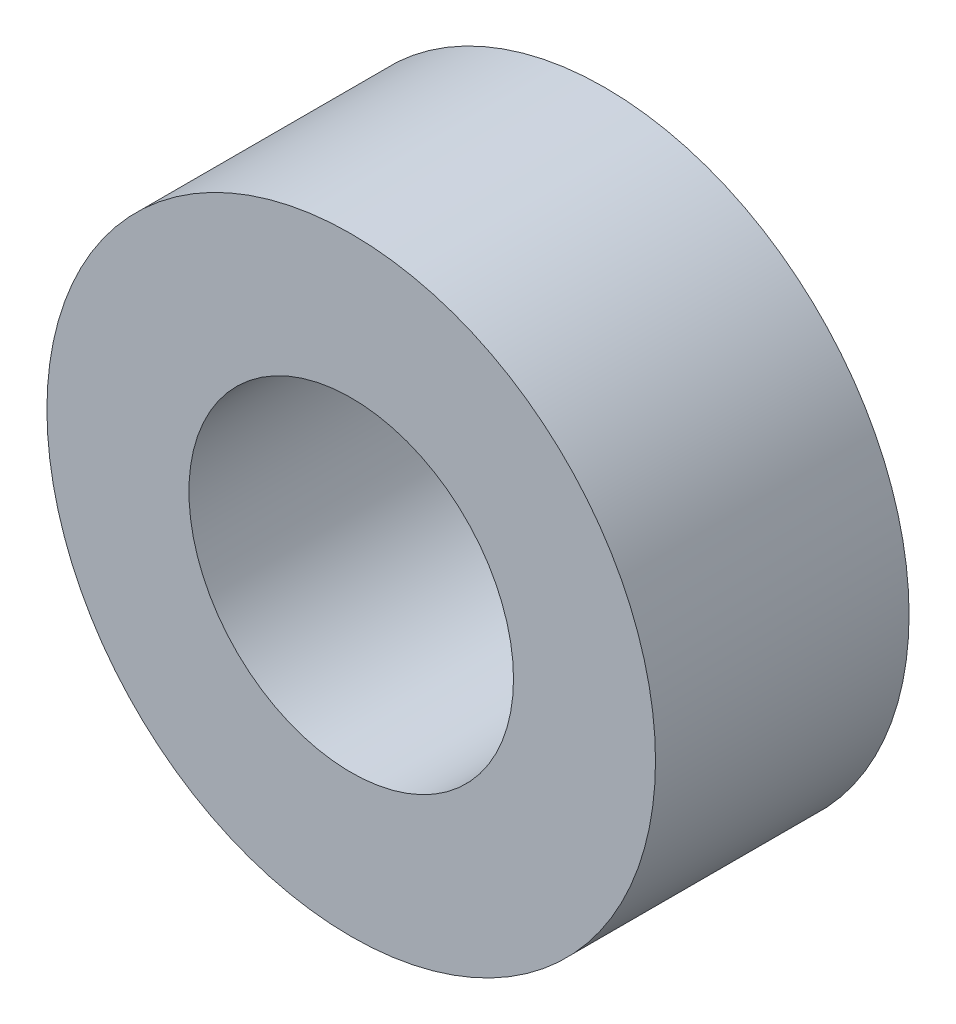
ISO-10303-21;
HEADER;
FILE_DESCRIPTION(('STEP AP214'),'2;1');
FILE_NAME('part.step','',(''),(''),'','','');
FILE_SCHEMA(('AUTOMOTIVE_DESIGN { 1 0 10303 214 1 1 1 1 }'));
ENDSEC;
DATA;
#1=APPLICATION_CONTEXT('core data for automotive mechanical design processes');
#2=APPLICATION_PROTOCOL_DEFINITION('international standard','automotive_design',2000,#1);
#3=PRODUCT_CONTEXT('',#1,'mechanical');
#4=PRODUCT('Part','Part','',(#3));
#5=PRODUCT_RELATED_PRODUCT_CATEGORY('part','',(#4));
#6=PRODUCT_DEFINITION_FORMATION('','',#4);
#7=PRODUCT_DEFINITION_CONTEXT('part definition',#1,'design');
#8=PRODUCT_DEFINITION('design','',#6,#7);
#9=PRODUCT_DEFINITION_SHAPE('','',#8);
#10=(LENGTH_UNIT() NAMED_UNIT(*) SI_UNIT(.MILLI.,.METRE.));
#11=(NAMED_UNIT(*) PLANE_ANGLE_UNIT() SI_UNIT($,.RADIAN.));
#12=(NAMED_UNIT(*) SI_UNIT($,.STERADIAN.) SOLID_ANGLE_UNIT());
#13=UNCERTAINTY_MEASURE_WITH_UNIT(LENGTH_MEASURE(1.E-05),#10,'distance_accuracy_value','');
#14=(GEOMETRIC_REPRESENTATION_CONTEXT(3) GLOBAL_UNCERTAINTY_ASSIGNED_CONTEXT((#13)) GLOBAL_UNIT_ASSIGNED_CONTEXT((#10,
#11,#12)) REPRESENTATION_CONTEXT('',''));
#15=CARTESIAN_POINT('',(0.,0.,0.));
#16=DIRECTION('',(0.,0.,1.));
#17=DIRECTION('',(1.,0.,0.));
#18=AXIS2_PLACEMENT_3D('',#15,#16,#17);
#19=CARTESIAN_POINT('',(0.,0.,2.5));
#20=DIRECTION('',(0.,0.,1.));
#21=DIRECTION('',(1.,0.,0.));
#22=AXIS2_PLACEMENT_3D('',#19,#20,#21);
#23=PLANE('',#22);
#24=CARTESIAN_POINT('',(0.,0.,2.5));
#25=DIRECTION('',(0.,0.,1.));
#26=DIRECTION('',(1.,0.,0.));
#27=AXIS2_PLACEMENT_3D('',#24,#25,#26);
#28=CIRCLE('',#27,3.);
#29=CARTESIAN_POINT('',(3.,0.,2.5));
#30=VERTEX_POINT('',#29);
#31=EDGE_CURVE('E10',#30,#30,#28,.T.);
#32=ORIENTED_EDGE('',*,*,#31,.T.);
#33=EDGE_LOOP('',(#32));
#34=FACE_BOUND('',#33,.T.);
#35=CARTESIAN_POINT('',(0.,0.,2.5));
#36=DIRECTION('',(0.,0.,1.));
#37=DIRECTION('',(1.,0.,0.));
#38=AXIS2_PLACEMENT_3D('',#35,#36,#37);
#39=CIRCLE('',#38,1.6);
#40=CARTESIAN_POINT('',(1.6,0.,2.5));
#41=VERTEX_POINT('',#40);
#42=EDGE_CURVE('E42',#41,#41,#39,.T.);
#43=ORIENTED_EDGE('',*,*,#42,.F.);
#44=EDGE_LOOP('',(#43));
#45=FACE_BOUND('',#44,.T.);
#46=ADVANCED_FACE('F31',(#34,#45),#23,.T.);
#47=CARTESIAN_POINT('',(0.,0.,0.));
#48=DIRECTION('',(0.,0.,1.));
#49=DIRECTION('',(1.,0.,0.));
#50=AXIS2_PLACEMENT_3D('',#47,#48,#49);
#51=PLANE('',#50);
#52=CARTESIAN_POINT('',(0.,0.,0.));
#53=DIRECTION('',(0.,0.,1.));
#54=DIRECTION('',(1.,0.,0.));
#55=AXIS2_PLACEMENT_3D('',#52,#53,#54);
#56=CIRCLE('',#55,3.);
#57=CARTESIAN_POINT('',(3.,0.,0.));
#58=VERTEX_POINT('',#57);
#59=EDGE_CURVE('E35',#58,#58,#56,.T.);
#60=ORIENTED_EDGE('',*,*,#59,.F.);
#61=EDGE_LOOP('',(#60));
#62=FACE_BOUND('',#61,.T.);
#63=CARTESIAN_POINT('',(0.,0.,0.));
#64=DIRECTION('',(0.,0.,1.));
#65=DIRECTION('',(1.,0.,0.));
#66=AXIS2_PLACEMENT_3D('',#63,#64,#65);
#67=CIRCLE('',#66,1.6);
#68=CARTESIAN_POINT('',(1.6,0.,0.));
#69=VERTEX_POINT('',#68);
#70=EDGE_CURVE('E44',#69,#69,#67,.T.);
#71=ORIENTED_EDGE('',*,*,#70,.T.);
#72=EDGE_LOOP('',(#71));
#73=FACE_BOUND('',#72,.T.);
#74=ADVANCED_FACE('F54',(#62,#73),#51,.F.);
#75=CARTESIAN_POINT('',(0.,0.,2.5));
#76=DIRECTION('',(0.,0.,-1.));
#77=DIRECTION('',(-1.,0.,0.));
#78=AXIS2_PLACEMENT_3D('',#75,#76,#77);
#79=CYLINDRICAL_SURFACE('',#78,3.);
#80=ORIENTED_EDGE('',*,*,#31,.F.);
#81=EDGE_LOOP('',(#80));
#82=FACE_BOUND('',#81,.T.);
#83=ORIENTED_EDGE('',*,*,#59,.T.);
#84=EDGE_LOOP('',(#83));
#85=FACE_BOUND('',#84,.T.);
#86=ADVANCED_FACE('F33',(#82,#85),#79,.T.);
#87=CARTESIAN_POINT('',(0.,0.,2.5));
#88=DIRECTION('',(0.,0.,-1.));
#89=DIRECTION('',(-1.,0.,0.));
#90=AXIS2_PLACEMENT_3D('',#87,#88,#89);
#91=CYLINDRICAL_SURFACE('',#90,1.6);
#92=ORIENTED_EDGE('',*,*,#42,.T.);
#93=EDGE_LOOP('',(#92));
#94=FACE_BOUND('',#93,.T.);
#95=ORIENTED_EDGE('',*,*,#70,.F.);
#96=EDGE_LOOP('',(#95));
#97=FACE_BOUND('',#96,.T.);
#98=ADVANCED_FACE('F50',(#94,#97),#91,.F.);
#99=CLOSED_SHELL('',(#46,#74,#86,#98));
#100=MANIFOLD_SOLID_BREP('B2',#99);
#101=ADVANCED_BREP_SHAPE_REPRESENTATION('',(#18,#100),#14);
#102=SHAPE_DEFINITION_REPRESENTATION(#9,#101);
ENDSEC;
END-ISO-10303-21;
